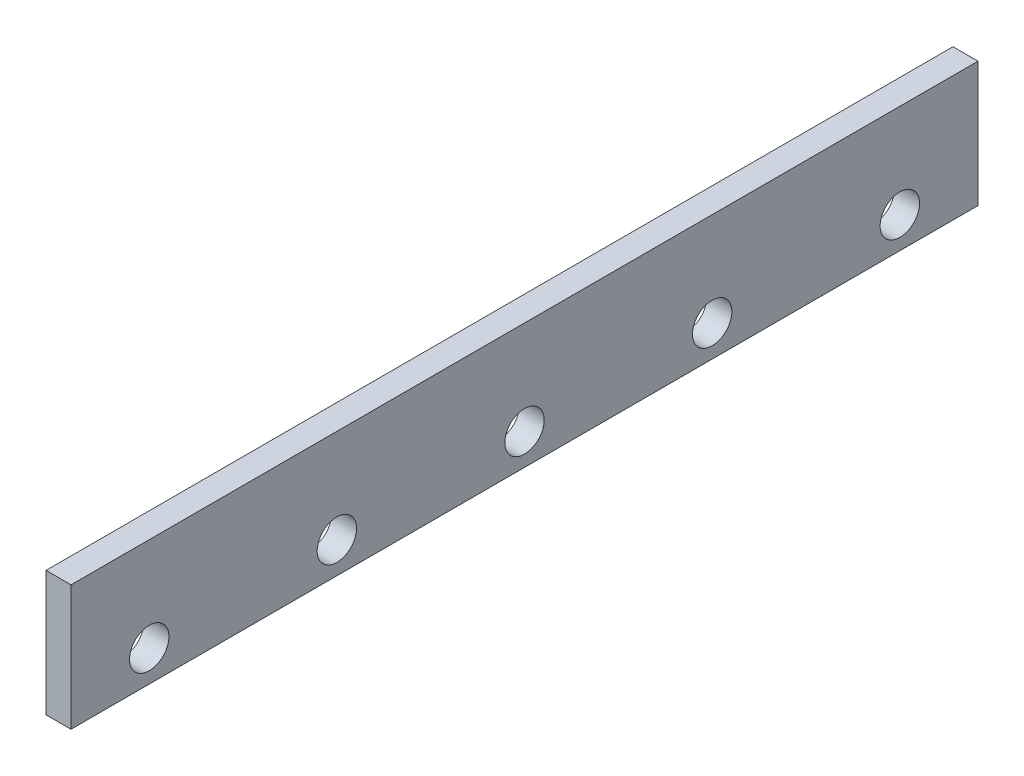
ISO-10303-21;
HEADER;
FILE_DESCRIPTION(('STEP AP214'),'2;1');
FILE_NAME('part.step','',(''),(''),'','','');
FILE_SCHEMA(('AUTOMOTIVE_DESIGN { 1 0 10303 214 1 1 1 1 }'));
ENDSEC;
DATA;
#1=APPLICATION_CONTEXT('core data for automotive mechanical design processes');
#2=APPLICATION_PROTOCOL_DEFINITION('international standard','automotive_design',2000,#1);
#3=PRODUCT_CONTEXT('',#1,'mechanical');
#4=PRODUCT('Part','Part','',(#3));
#5=PRODUCT_RELATED_PRODUCT_CATEGORY('part','',(#4));
#6=PRODUCT_DEFINITION_FORMATION('','',#4);
#7=PRODUCT_DEFINITION_CONTEXT('part definition',#1,'design');
#8=PRODUCT_DEFINITION('design','',#6,#7);
#9=PRODUCT_DEFINITION_SHAPE('','',#8);
#10=(LENGTH_UNIT() NAMED_UNIT(*) SI_UNIT(.MILLI.,.METRE.));
#11=(NAMED_UNIT(*) PLANE_ANGLE_UNIT() SI_UNIT($,.RADIAN.));
#12=(NAMED_UNIT(*) SI_UNIT($,.STERADIAN.) SOLID_ANGLE_UNIT());
#13=UNCERTAINTY_MEASURE_WITH_UNIT(LENGTH_MEASURE(1.E-05),#10,'distance_accuracy_value','');
#14=(GEOMETRIC_REPRESENTATION_CONTEXT(3) GLOBAL_UNCERTAINTY_ASSIGNED_CONTEXT((#13)) GLOBAL_UNIT_ASSIGNED_CONTEXT((#10,
#11,#12)) REPRESENTATION_CONTEXT('',''));
#15=CARTESIAN_POINT('',(0.,0.,0.));
#16=DIRECTION('',(0.,0.,1.));
#17=DIRECTION('',(1.,0.,0.));
#18=AXIS2_PLACEMENT_3D('',#15,#16,#17);
#19=CARTESIAN_POINT('',(-16.,40.,-290.));
#20=DIRECTION('',(0.,0.,-1.));
#21=DIRECTION('',(-1.,0.,0.));
#22=AXIS2_PLACEMENT_3D('',#19,#20,#21);
#23=PLANE('',#22);
#24=DIRECTION('',(0.,1.,0.));
#25=VECTOR('',#24,1.);
#26=CARTESIAN_POINT('',(0.,40.,-290.));
#27=LINE('',#26,#25);
#28=CARTESIAN_POINT('',(0.,-40.,-290.));
#29=VERTEX_POINT('',#28);
#30=CARTESIAN_POINT('',(0.,40.,-290.));
#31=VERTEX_POINT('',#30);
#32=EDGE_CURVE('E110',#29,#31,#27,.T.);
#33=ORIENTED_EDGE('',*,*,#32,.F.);
#34=DIRECTION('',(1.,0.,0.));
#35=VECTOR('',#34,1.);
#36=CARTESIAN_POINT('',(-16.,-40.,-290.));
#37=LINE('',#36,#35);
#38=CARTESIAN_POINT('',(-16.,-40.,-290.));
#39=VERTEX_POINT('',#38);
#40=EDGE_CURVE('E11',#39,#29,#37,.T.);
#41=ORIENTED_EDGE('',*,*,#40,.F.);
#42=DIRECTION('',(0.,1.,0.));
#43=VECTOR('',#42,1.);
#44=CARTESIAN_POINT('',(-16.,40.,-290.));
#45=LINE('',#44,#43);
#46=CARTESIAN_POINT('',(-16.,40.,-290.));
#47=VERTEX_POINT('',#46);
#48=EDGE_CURVE('E101',#39,#47,#45,.T.);
#49=ORIENTED_EDGE('',*,*,#48,.T.);
#50=DIRECTION('',(1.,0.,0.));
#51=VECTOR('',#50,1.);
#52=CARTESIAN_POINT('',(-16.,40.,-290.));
#53=LINE('',#52,#51);
#54=EDGE_CURVE('E42',#47,#31,#53,.T.);
#55=ORIENTED_EDGE('',*,*,#54,.T.);
#56=EDGE_LOOP('',(#33,#41,#49,#55));
#57=FACE_BOUND('',#56,.T.);
#58=ADVANCED_FACE('F39',(#57),#23,.T.);
#59=CARTESIAN_POINT('',(-16.,-40.,290.));
#60=DIRECTION('',(0.,-1.,0.));
#61=DIRECTION('',(0.,0.,-1.));
#62=AXIS2_PLACEMENT_3D('',#59,#60,#61);
#63=PLANE('',#62);
#64=DIRECTION('',(0.,0.,-1.));
#65=VECTOR('',#64,1.);
#66=CARTESIAN_POINT('',(0.,-40.,290.));
#67=LINE('',#66,#65);
#68=CARTESIAN_POINT('',(0.,-40.,290.));
#69=VERTEX_POINT('',#68);
#70=EDGE_CURVE('E104',#69,#29,#67,.T.);
#71=ORIENTED_EDGE('',*,*,#70,.F.);
#72=DIRECTION('',(1.,0.,0.));
#73=VECTOR('',#72,1.);
#74=CARTESIAN_POINT('',(-16.,-40.,290.));
#75=LINE('',#74,#73);
#76=CARTESIAN_POINT('',(-16.,-40.,290.));
#77=VERTEX_POINT('',#76);
#78=EDGE_CURVE('E49',#77,#69,#75,.T.);
#79=ORIENTED_EDGE('',*,*,#78,.F.);
#80=DIRECTION('',(0.,0.,-1.));
#81=VECTOR('',#80,1.);
#82=CARTESIAN_POINT('',(-16.,-40.,290.));
#83=LINE('',#82,#81);
#84=EDGE_CURVE('E96',#77,#39,#83,.T.);
#85=ORIENTED_EDGE('',*,*,#84,.T.);
#86=ORIENTED_EDGE('',*,*,#40,.T.);
#87=EDGE_LOOP('',(#71,#79,#85,#86));
#88=FACE_BOUND('',#87,.T.);
#89=ADVANCED_FACE('F127',(#88),#63,.T.);
#90=CARTESIAN_POINT('',(-16.,40.,290.));
#91=DIRECTION('',(0.,0.,1.));
#92=DIRECTION('',(1.,0.,0.));
#93=AXIS2_PLACEMENT_3D('',#90,#91,#92);
#94=PLANE('',#93);
#95=DIRECTION('',(0.,-1.,0.));
#96=VECTOR('',#95,1.);
#97=CARTESIAN_POINT('',(0.,40.,290.));
#98=LINE('',#97,#96);
#99=CARTESIAN_POINT('',(0.,40.,290.));
#100=VERTEX_POINT('',#99);
#101=EDGE_CURVE('E90',#100,#69,#98,.T.);
#102=ORIENTED_EDGE('',*,*,#101,.F.);
#103=DIRECTION('',(1.,0.,0.));
#104=VECTOR('',#103,1.);
#105=CARTESIAN_POINT('',(-16.,40.,290.));
#106=LINE('',#105,#104);
#107=CARTESIAN_POINT('',(-16.,40.,290.));
#108=VERTEX_POINT('',#107);
#109=EDGE_CURVE('E85',#108,#100,#106,.T.);
#110=ORIENTED_EDGE('',*,*,#109,.F.);
#111=DIRECTION('',(0.,-1.,0.));
#112=VECTOR('',#111,1.);
#113=CARTESIAN_POINT('',(-16.,40.,290.));
#114=LINE('',#113,#112);
#115=EDGE_CURVE('E88',#108,#77,#114,.T.);
#116=ORIENTED_EDGE('',*,*,#115,.T.);
#117=ORIENTED_EDGE('',*,*,#78,.T.);
#118=EDGE_LOOP('',(#102,#110,#116,#117));
#119=FACE_BOUND('',#118,.T.);
#120=ADVANCED_FACE('F87',(#119),#94,.T.);
#121=CARTESIAN_POINT('',(-16.,40.,290.));
#122=DIRECTION('',(0.,1.,0.));
#123=DIRECTION('',(0.,0.,1.));
#124=AXIS2_PLACEMENT_3D('',#121,#122,#123);
#125=PLANE('',#124);
#126=DIRECTION('',(0.,0.,1.));
#127=VECTOR('',#126,1.);
#128=CARTESIAN_POINT('',(0.,40.,290.));
#129=LINE('',#128,#127);
#130=EDGE_CURVE('E114',#31,#100,#129,.T.);
#131=ORIENTED_EDGE('',*,*,#130,.F.);
#132=ORIENTED_EDGE('',*,*,#54,.F.);
#133=DIRECTION('',(0.,0.,1.));
#134=VECTOR('',#133,1.);
#135=CARTESIAN_POINT('',(-16.,40.,290.));
#136=LINE('',#135,#134);
#137=EDGE_CURVE('E95',#47,#108,#136,.T.);
#138=ORIENTED_EDGE('',*,*,#137,.T.);
#139=ORIENTED_EDGE('',*,*,#109,.T.);
#140=EDGE_LOOP('',(#131,#132,#138,#139));
#141=FACE_BOUND('',#140,.T.);
#142=ADVANCED_FACE('F99',(#141),#125,.T.);
#143=CARTESIAN_POINT('',(-16.,0.,0.));
#144=DIRECTION('',(1.,0.,0.));
#145=DIRECTION('',(0.,0.,-1.));
#146=AXIS2_PLACEMENT_3D('',#143,#144,#145);
#147=PLANE('',#146);
#148=CARTESIAN_POINT('',(-16.,-20.,240.));
#149=DIRECTION('',(1.,0.,0.));
#150=DIRECTION('',(0.,0.,-1.));
#151=AXIS2_PLACEMENT_3D('',#148,#149,#150);
#152=CIRCLE('',#151,12.6);
#153=CARTESIAN_POINT('',(-16.,-20.,227.4));
#154=VERTEX_POINT('',#153);
#155=EDGE_CURVE('E115',#154,#154,#152,.T.);
#156=ORIENTED_EDGE('',*,*,#155,.T.);
#157=EDGE_LOOP('',(#156));
#158=FACE_BOUND('',#157,.T.);
#159=CARTESIAN_POINT('',(-16.,-20.,120.));
#160=DIRECTION('',(1.,0.,0.));
#161=DIRECTION('',(0.,0.,-1.));
#162=AXIS2_PLACEMENT_3D('',#159,#160,#161);
#163=CIRCLE('',#162,12.6);
#164=CARTESIAN_POINT('',(-16.,-20.,107.4));
#165=VERTEX_POINT('',#164);
#166=EDGE_CURVE('E176',#165,#165,#163,.T.);
#167=ORIENTED_EDGE('',*,*,#166,.T.);
#168=EDGE_LOOP('',(#167));
#169=FACE_BOUND('',#168,.T.);
#170=CARTESIAN_POINT('',(-16.,-20.,0.));
#171=DIRECTION('',(1.,0.,0.));
#172=DIRECTION('',(0.,0.,-1.));
#173=AXIS2_PLACEMENT_3D('',#170,#171,#172);
#174=CIRCLE('',#173,12.6);
#175=CARTESIAN_POINT('',(-16.,-20.,-12.6000000000001));
#176=VERTEX_POINT('',#175);
#177=EDGE_CURVE('E188',#176,#176,#174,.T.);
#178=ORIENTED_EDGE('',*,*,#177,.T.);
#179=EDGE_LOOP('',(#178));
#180=FACE_BOUND('',#179,.T.);
#181=CARTESIAN_POINT('',(-16.,-20.,-120.));
#182=DIRECTION('',(1.,0.,0.));
#183=DIRECTION('',(0.,0.,-1.));
#184=AXIS2_PLACEMENT_3D('',#181,#182,#183);
#185=CIRCLE('',#184,12.6);
#186=CARTESIAN_POINT('',(-16.,-20.,-132.6));
#187=VERTEX_POINT('',#186);
#188=EDGE_CURVE('E196',#187,#187,#185,.T.);
#189=ORIENTED_EDGE('',*,*,#188,.T.);
#190=EDGE_LOOP('',(#189));
#191=FACE_BOUND('',#190,.T.);
#192=CARTESIAN_POINT('',(-16.,-20.,-240.));
#193=DIRECTION('',(1.,0.,0.));
#194=DIRECTION('',(0.,0.,-1.));
#195=AXIS2_PLACEMENT_3D('',#192,#193,#194);
#196=CIRCLE('',#195,12.6);
#197=CARTESIAN_POINT('',(-16.,-20.,-252.6));
#198=VERTEX_POINT('',#197);
#199=EDGE_CURVE('E204',#198,#198,#196,.T.);
#200=ORIENTED_EDGE('',*,*,#199,.T.);
#201=EDGE_LOOP('',(#200));
#202=FACE_BOUND('',#201,.T.);
#203=ORIENTED_EDGE('',*,*,#48,.F.);
#204=ORIENTED_EDGE('',*,*,#84,.F.);
#205=ORIENTED_EDGE('',*,*,#115,.F.);
#206=ORIENTED_EDGE('',*,*,#137,.F.);
#207=EDGE_LOOP('',(#203,#204,#205,#206));
#208=FACE_BOUND('',#207,.T.);
#209=ADVANCED_FACE('F94',(#158,#169,#180,#191,#202,#208),#147,.F.);
#210=CARTESIAN_POINT('',(0.,0.,0.));
#211=DIRECTION('',(1.,0.,0.));
#212=DIRECTION('',(0.,0.,-1.));
#213=AXIS2_PLACEMENT_3D('',#210,#211,#212);
#214=PLANE('',#213);
#215=CARTESIAN_POINT('',(0.,-20.,240.));
#216=DIRECTION('',(1.,0.,0.));
#217=DIRECTION('',(0.,0.,-1.));
#218=AXIS2_PLACEMENT_3D('',#215,#216,#217);
#219=CIRCLE('',#218,12.6);
#220=CARTESIAN_POINT('',(0.,-20.,227.4));
#221=VERTEX_POINT('',#220);
#222=EDGE_CURVE('E174',#221,#221,#219,.T.);
#223=ORIENTED_EDGE('',*,*,#222,.F.);
#224=EDGE_LOOP('',(#223));
#225=FACE_BOUND('',#224,.T.);
#226=CARTESIAN_POINT('',(0.,-20.,120.));
#227=DIRECTION('',(1.,0.,0.));
#228=DIRECTION('',(0.,0.,-1.));
#229=AXIS2_PLACEMENT_3D('',#226,#227,#228);
#230=CIRCLE('',#229,12.6);
#231=CARTESIAN_POINT('',(0.,-20.,107.4));
#232=VERTEX_POINT('',#231);
#233=EDGE_CURVE('E182',#232,#232,#230,.T.);
#234=ORIENTED_EDGE('',*,*,#233,.F.);
#235=EDGE_LOOP('',(#234));
#236=FACE_BOUND('',#235,.T.);
#237=CARTESIAN_POINT('',(0.,-20.,0.));
#238=DIRECTION('',(1.,0.,0.));
#239=DIRECTION('',(0.,0.,-1.));
#240=AXIS2_PLACEMENT_3D('',#237,#238,#239);
#241=CIRCLE('',#240,12.6);
#242=CARTESIAN_POINT('',(0.,-20.,-12.6000000000001));
#243=VERTEX_POINT('',#242);
#244=EDGE_CURVE('E192',#243,#243,#241,.T.);
#245=ORIENTED_EDGE('',*,*,#244,.F.);
#246=EDGE_LOOP('',(#245));
#247=FACE_BOUND('',#246,.T.);
#248=CARTESIAN_POINT('',(0.,-20.,-120.));
#249=DIRECTION('',(1.,0.,0.));
#250=DIRECTION('',(0.,0.,-1.));
#251=AXIS2_PLACEMENT_3D('',#248,#249,#250);
#252=CIRCLE('',#251,12.6);
#253=CARTESIAN_POINT('',(0.,-20.,-132.6));
#254=VERTEX_POINT('',#253);
#255=EDGE_CURVE('E200',#254,#254,#252,.T.);
#256=ORIENTED_EDGE('',*,*,#255,.F.);
#257=EDGE_LOOP('',(#256));
#258=FACE_BOUND('',#257,.T.);
#259=CARTESIAN_POINT('',(0.,-20.,-240.));
#260=DIRECTION('',(1.,0.,0.));
#261=DIRECTION('',(0.,0.,-1.));
#262=AXIS2_PLACEMENT_3D('',#259,#260,#261);
#263=CIRCLE('',#262,12.6);
#264=CARTESIAN_POINT('',(0.,-20.,-252.6));
#265=VERTEX_POINT('',#264);
#266=EDGE_CURVE('E207',#265,#265,#263,.T.);
#267=ORIENTED_EDGE('',*,*,#266,.F.);
#268=EDGE_LOOP('',(#267));
#269=FACE_BOUND('',#268,.T.);
#270=ORIENTED_EDGE('',*,*,#32,.T.);
#271=ORIENTED_EDGE('',*,*,#130,.T.);
#272=ORIENTED_EDGE('',*,*,#101,.T.);
#273=ORIENTED_EDGE('',*,*,#70,.T.);
#274=EDGE_LOOP('',(#270,#271,#272,#273));
#275=FACE_BOUND('',#274,.T.);
#276=ADVANCED_FACE('F126',(#225,#236,#247,#258,#269,#275),#214,.T.);
#277=CARTESIAN_POINT('',(-16.,-20.,-240.));
#278=DIRECTION('',(1.,0.,0.));
#279=DIRECTION('',(0.,0.,-1.));
#280=AXIS2_PLACEMENT_3D('',#277,#278,#279);
#281=CYLINDRICAL_SURFACE('',#280,12.6);
#282=ORIENTED_EDGE('',*,*,#199,.F.);
#283=EDGE_LOOP('',(#282));
#284=FACE_BOUND('',#283,.T.);
#285=ORIENTED_EDGE('',*,*,#266,.T.);
#286=EDGE_LOOP('',(#285));
#287=FACE_BOUND('',#286,.T.);
#288=ADVANCED_FACE('F145',(#284,#287),#281,.F.);
#289=CARTESIAN_POINT('',(-16.,-20.,-120.));
#290=DIRECTION('',(1.,0.,0.));
#291=DIRECTION('',(0.,0.,-1.));
#292=AXIS2_PLACEMENT_3D('',#289,#290,#291);
#293=CYLINDRICAL_SURFACE('',#292,12.6);
#294=ORIENTED_EDGE('',*,*,#188,.F.);
#295=EDGE_LOOP('',(#294));
#296=FACE_BOUND('',#295,.T.);
#297=ORIENTED_EDGE('',*,*,#255,.T.);
#298=EDGE_LOOP('',(#297));
#299=FACE_BOUND('',#298,.T.);
#300=ADVANCED_FACE('F152',(#296,#299),#293,.F.);
#301=CARTESIAN_POINT('',(-16.,-20.,0.));
#302=DIRECTION('',(1.,0.,0.));
#303=DIRECTION('',(0.,0.,-1.));
#304=AXIS2_PLACEMENT_3D('',#301,#302,#303);
#305=CYLINDRICAL_SURFACE('',#304,12.6);
#306=ORIENTED_EDGE('',*,*,#177,.F.);
#307=EDGE_LOOP('',(#306));
#308=FACE_BOUND('',#307,.T.);
#309=ORIENTED_EDGE('',*,*,#244,.T.);
#310=EDGE_LOOP('',(#309));
#311=FACE_BOUND('',#310,.T.);
#312=ADVANCED_FACE('F156',(#308,#311),#305,.F.);
#313=CARTESIAN_POINT('',(-16.,-20.,120.));
#314=DIRECTION('',(1.,0.,0.));
#315=DIRECTION('',(0.,0.,-1.));
#316=AXIS2_PLACEMENT_3D('',#313,#314,#315);
#317=CYLINDRICAL_SURFACE('',#316,12.6);
#318=ORIENTED_EDGE('',*,*,#166,.F.);
#319=EDGE_LOOP('',(#318));
#320=FACE_BOUND('',#319,.T.);
#321=ORIENTED_EDGE('',*,*,#233,.T.);
#322=EDGE_LOOP('',(#321));
#323=FACE_BOUND('',#322,.T.);
#324=ADVANCED_FACE('F160',(#320,#323),#317,.F.);
#325=CARTESIAN_POINT('',(-16.,-20.,240.));
#326=DIRECTION('',(1.,0.,0.));
#327=DIRECTION('',(0.,0.,-1.));
#328=AXIS2_PLACEMENT_3D('',#325,#326,#327);
#329=CYLINDRICAL_SURFACE('',#328,12.6);
#330=ORIENTED_EDGE('',*,*,#155,.F.);
#331=EDGE_LOOP('',(#330));
#332=FACE_BOUND('',#331,.T.);
#333=ORIENTED_EDGE('',*,*,#222,.T.);
#334=EDGE_LOOP('',(#333));
#335=FACE_BOUND('',#334,.T.);
#336=ADVANCED_FACE('F164',(#332,#335),#329,.F.);
#337=CLOSED_SHELL('',(#58,#89,#120,#142,#209,#276,#288,#300,#312,#324,#336));
#338=MANIFOLD_SOLID_BREP('B2',#337);
#339=ADVANCED_BREP_SHAPE_REPRESENTATION('',(#18,#338),#14);
#340=SHAPE_DEFINITION_REPRESENTATION(#9,#339);
ENDSEC;
END-ISO-10303-21;
